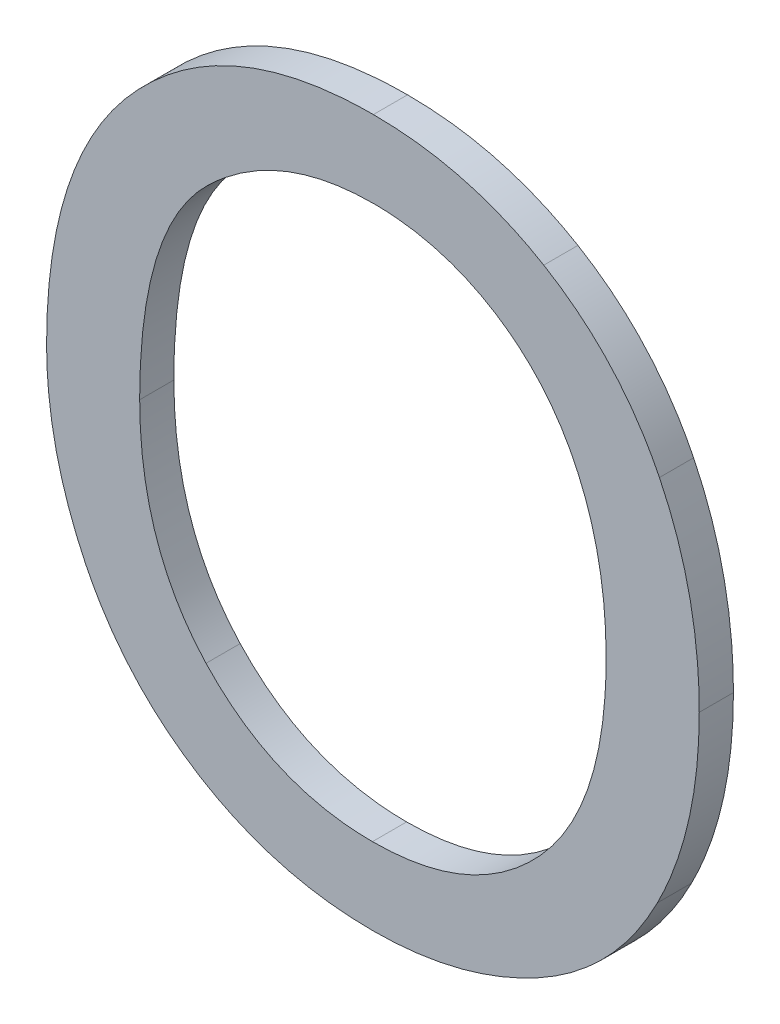
ISO-10303-21;
HEADER;
FILE_DESCRIPTION(('STEP AP214'),'2;1');
FILE_NAME('part.step','',(''),(''),'','','');
FILE_SCHEMA(('AUTOMOTIVE_DESIGN { 1 0 10303 214 1 1 1 1 }'));
ENDSEC;
DATA;
#1=APPLICATION_CONTEXT('core data for automotive mechanical design processes');
#2=APPLICATION_PROTOCOL_DEFINITION('international standard','automotive_design',2000,#1);
#3=PRODUCT_CONTEXT('',#1,'mechanical');
#4=PRODUCT('Part','Part','',(#3));
#5=PRODUCT_RELATED_PRODUCT_CATEGORY('part','',(#4));
#6=PRODUCT_DEFINITION_FORMATION('','',#4);
#7=PRODUCT_DEFINITION_CONTEXT('part definition',#1,'design');
#8=PRODUCT_DEFINITION('design','',#6,#7);
#9=PRODUCT_DEFINITION_SHAPE('','',#8);
#10=(LENGTH_UNIT() NAMED_UNIT(*) SI_UNIT(.MILLI.,.METRE.));
#11=(NAMED_UNIT(*) PLANE_ANGLE_UNIT() SI_UNIT($,.RADIAN.));
#12=(NAMED_UNIT(*) SI_UNIT($,.STERADIAN.) SOLID_ANGLE_UNIT());
#13=UNCERTAINTY_MEASURE_WITH_UNIT(LENGTH_MEASURE(1.E-05),#10,'distance_accuracy_value','');
#14=(GEOMETRIC_REPRESENTATION_CONTEXT(3) GLOBAL_UNCERTAINTY_ASSIGNED_CONTEXT((#13)) GLOBAL_UNIT_ASSIGNED_CONTEXT((#10,
#11,#12)) REPRESENTATION_CONTEXT('',''));
#15=CARTESIAN_POINT('',(0.,0.,0.));
#16=DIRECTION('',(0.,0.,1.));
#17=DIRECTION('',(1.,0.,0.));
#18=AXIS2_PLACEMENT_3D('',#15,#16,#17);
#19=CARTESIAN_POINT('',(7.100964176169,0.499921920118,0.05));
#20=DIRECTION('',(0.,0.,1.));
#21=DIRECTION('',(1.,0.,0.));
#22=AXIS2_PLACEMENT_3D('',#19,#20,#21);
#23=PLANE('',#22);
#24=CARTESIAN_POINT('',(6.759038880814,0.484965479651,0.05));
#25=CARTESIAN_POINT('',(6.759038880814,0.303733648256,0.05));
#26=CARTESIAN_POINT('',(6.856104651163,0.199445857558,0.05));
#27=(BOUNDED_CURVE() B_SPLINE_CURVE(2,(#24,#25,#26),.UNSPECIFIED.,.F.,
.F.) B_SPLINE_CURVE_WITH_KNOTS((3,3),(0.,1.),
.UNSPECIFIED.) CURVE() GEOMETRIC_REPRESENTATION_ITEM() RATIONAL_B_SPLINE_CURVE((1.,1.,1.)) REPRESENTATION_ITEM(''));
#28=CARTESIAN_POINT('',(6.759038880814,0.484965479651,0.05));
#29=VERTEX_POINT('',#28);
#30=CARTESIAN_POINT('',(6.856104651163,0.199445857558,0.05));
#31=VERTEX_POINT('',#30);
#32=EDGE_CURVE('E260',#29,#31,#27,.T.);
#33=ORIENTED_EDGE('',*,*,#32,.F.);
#34=CARTESIAN_POINT('',(6.860192587209,0.80804869186,0.05));
#35=CARTESIAN_POINT('',(6.759038880814,0.711300872093,0.05));
#36=CARTESIAN_POINT('',(6.759038880814,0.484965479651,0.05));
#37=(BOUNDED_CURVE() B_SPLINE_CURVE(2,(#34,#35,#36),.UNSPECIFIED.,.F.,
.F.) B_SPLINE_CURVE_WITH_KNOTS((3,3),(0.,1.),
.UNSPECIFIED.) CURVE() GEOMETRIC_REPRESENTATION_ITEM() RATIONAL_B_SPLINE_CURVE((1.,1.,1.)) REPRESENTATION_ITEM(''));
#38=CARTESIAN_POINT('',(6.860192587209,0.80804869186,0.05));
#39=VERTEX_POINT('',#38);
#40=EDGE_CURVE('E243',#39,#29,#37,.T.);
#41=ORIENTED_EDGE('',*,*,#40,.F.);
#42=CARTESIAN_POINT('',(7.101744186047,0.904796511628,0.05));
#43=CARTESIAN_POINT('',(6.961391715116,0.904796511628,0.05));
#44=CARTESIAN_POINT('',(6.860192587209,0.80804869186,0.05));
#45=(BOUNDED_CURVE() B_SPLINE_CURVE(2,(#42,#43,#44),.UNSPECIFIED.,.F.,
.F.) B_SPLINE_CURVE_WITH_KNOTS((3,3),(0.,1.),
.UNSPECIFIED.) CURVE() GEOMETRIC_REPRESENTATION_ITEM() RATIONAL_B_SPLINE_CURVE((1.,1.,1.)) REPRESENTATION_ITEM(''));
#46=CARTESIAN_POINT('',(7.101744186047,0.904796511628,0.05));
#47=VERTEX_POINT('',#46);
#48=EDGE_CURVE('E305',#47,#39,#45,.T.);
#49=ORIENTED_EDGE('',*,*,#48,.F.);
#50=CARTESIAN_POINT('',(7.279887354651,0.854514898256,0.05));
#51=CARTESIAN_POINT('',(7.200535973837,0.904796511628,0.05));
#52=CARTESIAN_POINT('',(7.101744186047,0.904796511628,0.05));
#53=(BOUNDED_CURVE() B_SPLINE_CURVE(2,(#50,#51,#52),.UNSPECIFIED.,.F.,
.F.) B_SPLINE_CURVE_WITH_KNOTS((3,3),(0.,1.),
.UNSPECIFIED.) CURVE() GEOMETRIC_REPRESENTATION_ITEM() RATIONAL_B_SPLINE_CURVE((1.,1.,1.)) REPRESENTATION_ITEM(''));
#54=CARTESIAN_POINT('',(7.279887354651,0.854514898256,0.05));
#55=VERTEX_POINT('',#54);
#56=EDGE_CURVE('E258',#55,#47,#53,.T.);
#57=ORIENTED_EDGE('',*,*,#56,.F.);
#58=CARTESIAN_POINT('',(7.400481468023,0.712981468023,0.05));
#59=CARTESIAN_POINT('',(7.359284156977,0.804278706395,0.05));
#60=CARTESIAN_POINT('',(7.279887354651,0.854514898256,0.05));
#61=(BOUNDED_CURVE() B_SPLINE_CURVE(2,(#58,#59,#60),.UNSPECIFIED.,.F.,
.F.) B_SPLINE_CURVE_WITH_KNOTS((3,3),(0.,1.),
.UNSPECIFIED.) CURVE() GEOMETRIC_REPRESENTATION_ITEM() RATIONAL_B_SPLINE_CURVE((1.,1.,1.)) REPRESENTATION_ITEM(''));
#62=CARTESIAN_POINT('',(7.400481468023,0.712981468023,0.05));
#63=VERTEX_POINT('',#62);
#64=EDGE_CURVE('E320',#63,#55,#61,.T.);
#65=ORIENTED_EDGE('',*,*,#64,.F.);
#66=CARTESIAN_POINT('',(7.441724200581,0.499318677326,0.05));
#67=CARTESIAN_POINT('',(7.441724200581,0.621729651163,0.05));
#68=CARTESIAN_POINT('',(7.400481468023,0.712981468023,0.05));
#69=(BOUNDED_CURVE() B_SPLINE_CURVE(2,(#66,#67,#68),.UNSPECIFIED.,.F.,
.F.) B_SPLINE_CURVE_WITH_KNOTS((3,3),(0.,1.),
.UNSPECIFIED.) CURVE() GEOMETRIC_REPRESENTATION_ITEM() RATIONAL_B_SPLINE_CURVE((1.,1.,1.)) REPRESENTATION_ITEM(''));
#70=CARTESIAN_POINT('',(7.441724200581,0.499318677326,0.05));
#71=VERTEX_POINT('',#70);
#72=EDGE_CURVE('E547',#71,#63,#69,.T.);
#73=ORIENTED_EDGE('',*,*,#72,.F.);
#74=CARTESIAN_POINT('',(7.345294331395,0.200490552326,0.05));
#75=CARTESIAN_POINT('',(7.441724200581,0.305823037791,0.05));
#76=CARTESIAN_POINT('',(7.441724200581,0.499318677326,0.05));
#77=(BOUNDED_CURVE() B_SPLINE_CURVE(2,(#74,#75,#76),.UNSPECIFIED.,.F.,
.F.) B_SPLINE_CURVE_WITH_KNOTS((3,3),(0.,1.),
.UNSPECIFIED.) CURVE() GEOMETRIC_REPRESENTATION_ITEM() RATIONAL_B_SPLINE_CURVE((1.,1.,1.)) REPRESENTATION_ITEM(''));
#78=CARTESIAN_POINT('',(7.345294331395,0.200490552326,0.05));
#79=VERTEX_POINT('',#78);
#80=EDGE_CURVE('E330',#79,#71,#77,.T.);
#81=ORIENTED_EDGE('',*,*,#80,.F.);
#82=CARTESIAN_POINT('',(7.099700218023,0.09520348837209,0.05));
#83=CARTESIAN_POINT('',(7.248909883721,0.09520348837209,0.05));
#84=CARTESIAN_POINT('',(7.345294331395,0.200490552326,0.05));
#85=(BOUNDED_CURVE() B_SPLINE_CURVE(2,(#82,#83,#84),.UNSPECIFIED.,.F.,
.F.) B_SPLINE_CURVE_WITH_KNOTS((3,3),(0.,1.),
.UNSPECIFIED.) CURVE() GEOMETRIC_REPRESENTATION_ITEM() RATIONAL_B_SPLINE_CURVE((1.,1.,1.)) REPRESENTATION_ITEM(''));
#86=CARTESIAN_POINT('',(7.099700218023,0.09520348837209,0.05));
#87=VERTEX_POINT('',#86);
#88=EDGE_CURVE('E281',#87,#79,#85,.T.);
#89=ORIENTED_EDGE('',*,*,#88,.F.);
#90=CARTESIAN_POINT('',(6.856104651163,0.199445857558,0.05));
#91=CARTESIAN_POINT('',(6.953215843023,0.09520348837209,0.05));
#92=CARTESIAN_POINT('',(7.099700218023,0.09520348837209,0.05));
#93=(BOUNDED_CURVE() B_SPLINE_CURVE(2,(#90,#91,#92),.UNSPECIFIED.,.F.,
.F.) B_SPLINE_CURVE_WITH_KNOTS((3,3),(0.,1.),
.UNSPECIFIED.) CURVE() GEOMETRIC_REPRESENTATION_ITEM() RATIONAL_B_SPLINE_CURVE((1.,1.,1.)) REPRESENTATION_ITEM(''));
#94=EDGE_CURVE('E29',#31,#87,#93,.T.);
#95=ORIENTED_EDGE('',*,*,#94,.F.);
#96=EDGE_LOOP('',(#33,#41,#49,#57,#65,#73,#81,#89,#95));
#97=FACE_BOUND('',#96,.T.);
#98=CARTESIAN_POINT('',(6.62277434593,0.486691497093,0.05));
#99=CARTESIAN_POINT('',(6.62277434593,0.735692223837,0.05));
#100=CARTESIAN_POINT('',(6.756313590116,0.876544331395,0.05));
#101=(BOUNDED_CURVE() B_SPLINE_CURVE(2,(#98,#99,#100),.UNSPECIFIED.,.F.,
.F.) B_SPLINE_CURVE_WITH_KNOTS((3,3),(0.,1.),
.UNSPECIFIED.) CURVE() GEOMETRIC_REPRESENTATION_ITEM() RATIONAL_B_SPLINE_CURVE((1.,1.,1.)) REPRESENTATION_ITEM(''));
#102=CARTESIAN_POINT('',(6.62277434593,0.486691497093,0.05));
#103=VERTEX_POINT('',#102);
#104=CARTESIAN_POINT('',(6.756313590116,0.876544331395,0.05));
#105=VERTEX_POINT('',#104);
#106=EDGE_CURVE('E293',#103,#105,#101,.T.);
#107=ORIENTED_EDGE('',*,*,#106,.F.);
#108=CARTESIAN_POINT('',(6.680005450581,0.237009447674,0.05));
#109=CARTESIAN_POINT('',(6.62277434593,0.355014534884,0.05));
#110=CARTESIAN_POINT('',(6.62277434593,0.486691497093,0.05));
#111=(BOUNDED_CURVE() B_SPLINE_CURVE(2,(#108,#109,#110),.UNSPECIFIED.,.F.,
.F.) B_SPLINE_CURVE_WITH_KNOTS((3,3),(0.,1.),
.UNSPECIFIED.) CURVE() GEOMETRIC_REPRESENTATION_ITEM() RATIONAL_B_SPLINE_CURVE((1.,1.,1.)) REPRESENTATION_ITEM(''));
#112=CARTESIAN_POINT('',(6.680005450581,0.237009447674,0.05));
#113=VERTEX_POINT('',#112);
#114=EDGE_CURVE('E275',#113,#103,#111,.T.);
#115=ORIENTED_EDGE('',*,*,#114,.F.);
#116=CARTESIAN_POINT('',(6.848292151163,0.05078125,0.05));
#117=CARTESIAN_POINT('',(6.737236555233,0.119004360465,0.05));
#118=CARTESIAN_POINT('',(6.680005450581,0.237009447674,0.05));
#119=(BOUNDED_CURVE() B_SPLINE_CURVE(2,(#116,#117,#118),.UNSPECIFIED.,.F.,
.F.) B_SPLINE_CURVE_WITH_KNOTS((3,3),(0.,1.),
.UNSPECIFIED.) CURVE() GEOMETRIC_REPRESENTATION_ITEM() RATIONAL_B_SPLINE_CURVE((1.,1.,1.)) REPRESENTATION_ITEM(''));
#120=CARTESIAN_POINT('',(6.848292151163,0.05078125,0.05));
#121=VERTEX_POINT('',#120);
#122=EDGE_CURVE('E310',#121,#113,#119,.T.);
#123=ORIENTED_EDGE('',*,*,#122,.F.);
#124=CARTESIAN_POINT('',(7.100381540698,-0.01744186046512,0.05));
#125=CARTESIAN_POINT('',(6.959347747093,-0.01744186046512,0.05));
#126=CARTESIAN_POINT('',(6.848292151163,0.05078125,0.05));
#127=(BOUNDED_CURVE() B_SPLINE_CURVE(2,(#124,#125,#126),.UNSPECIFIED.,.F.,
.F.) B_SPLINE_CURVE_WITH_KNOTS((3,3),(0.,1.),
.UNSPECIFIED.) CURVE() GEOMETRIC_REPRESENTATION_ITEM() RATIONAL_B_SPLINE_CURVE((1.,1.,1.)) REPRESENTATION_ITEM(''));
#128=CARTESIAN_POINT('',(7.100381540698,-0.01744186046512,0.05));
#129=VERTEX_POINT('',#128);
#130=EDGE_CURVE('E467',#129,#121,#127,.T.);
#131=ORIENTED_EDGE('',*,*,#130,.F.);
#132=CARTESIAN_POINT('',(7.342932412791,0.04428597383721,0.05));
#133=CARTESIAN_POINT('',(7.230514171512,-0.01744186046512,0.05));
#134=CARTESIAN_POINT('',(7.100381540698,-0.01744186046512,0.05));
#135=(BOUNDED_CURVE() B_SPLINE_CURVE(2,(#132,#133,#134),.UNSPECIFIED.,.F.,
.F.) B_SPLINE_CURVE_WITH_KNOTS((3,3),(0.,1.),
.UNSPECIFIED.) CURVE() GEOMETRIC_REPRESENTATION_ITEM() RATIONAL_B_SPLINE_CURVE((1.,1.,1.)) REPRESENTATION_ITEM(''));
#136=CARTESIAN_POINT('',(7.342932412791,0.04428597383721,0.05));
#137=VERTEX_POINT('',#136);
#138=EDGE_CURVE('E409',#137,#129,#135,.T.);
#139=ORIENTED_EDGE('',*,*,#138,.F.);
#140=CARTESIAN_POINT('',(7.516669694767,0.226062863372,0.05));
#141=CARTESIAN_POINT('',(7.45535065407,0.10601380814,0.05));
#142=CARTESIAN_POINT('',(7.342932412791,0.04428597383721,0.05));
#143=(BOUNDED_CURVE() B_SPLINE_CURVE(2,(#140,#141,#142),.UNSPECIFIED.,.F.,
.F.) B_SPLINE_CURVE_WITH_KNOTS((3,3),(0.,1.),
.UNSPECIFIED.) CURVE() GEOMETRIC_REPRESENTATION_ITEM() RATIONAL_B_SPLINE_CURVE((1.,1.,1.)) REPRESENTATION_ITEM(''));
#144=CARTESIAN_POINT('',(7.516669694767,0.226062863372,0.05));
#145=VERTEX_POINT('',#144);
#146=EDGE_CURVE('E232',#145,#137,#143,.T.);
#147=ORIENTED_EDGE('',*,*,#146,.F.);
#148=CARTESIAN_POINT('',(7.577988735465,0.498273982558,0.05));
#149=CARTESIAN_POINT('',(7.577988735465,0.346157340116,0.05));
#150=CARTESIAN_POINT('',(7.516669694767,0.226062863372,0.05));
#151=(BOUNDED_CURVE() B_SPLINE_CURVE(2,(#148,#149,#150),.UNSPECIFIED.,.F.,
.F.) B_SPLINE_CURVE_WITH_KNOTS((3,3),(0.,1.),
.UNSPECIFIED.) CURVE() GEOMETRIC_REPRESENTATION_ITEM() RATIONAL_B_SPLINE_CURVE((1.,1.,1.)) REPRESENTATION_ITEM(''));
#152=CARTESIAN_POINT('',(7.577988735465,0.498273982558,0.05));
#153=VERTEX_POINT('',#152);
#154=EDGE_CURVE('E219',#153,#145,#151,.T.);
#155=ORIENTED_EDGE('',*,*,#154,.F.);
#156=CARTESIAN_POINT('',(7.519712936047,0.766715116279,0.05));
#157=CARTESIAN_POINT('',(7.577988735465,0.648392078488,0.05));
#158=CARTESIAN_POINT('',(7.577988735465,0.498273982558,0.05));
#159=(BOUNDED_CURVE() B_SPLINE_CURVE(2,(#156,#157,#158),.UNSPECIFIED.,.F.,
.F.) B_SPLINE_CURVE_WITH_KNOTS((3,3),(0.,1.),
.UNSPECIFIED.) CURVE() GEOMETRIC_REPRESENTATION_ITEM() RATIONAL_B_SPLINE_CURVE((1.,1.,1.)) REPRESENTATION_ITEM(''));
#160=CARTESIAN_POINT('',(7.519712936047,0.766715116279,0.05));
#161=VERTEX_POINT('',#160);
#162=EDGE_CURVE('E208',#161,#153,#159,.T.);
#163=ORIENTED_EDGE('',*,*,#162,.F.);
#164=CARTESIAN_POINT('',(7.350426962209,0.951262718023,0.05));
#165=CARTESIAN_POINT('',(7.46148255814,0.885083575581,0.05));
#166=CARTESIAN_POINT('',(7.519712936047,0.766715116279,0.05));
#167=(BOUNDED_CURVE() B_SPLINE_CURVE(2,(#164,#165,#166),.UNSPECIFIED.,.F.,
.F.) B_SPLINE_CURVE_WITH_KNOTS((3,3),(0.,1.),
.UNSPECIFIED.) CURVE() GEOMETRIC_REPRESENTATION_ITEM() RATIONAL_B_SPLINE_CURVE((1.,1.,1.)) REPRESENTATION_ITEM(''));
#168=CARTESIAN_POINT('',(7.350426962209,0.951262718023,0.05));
#169=VERTEX_POINT('',#168);
#170=EDGE_CURVE('E304',#169,#161,#167,.T.);
#171=ORIENTED_EDGE('',*,*,#170,.F.);
#172=CARTESIAN_POINT('',(7.101062863372,1.017441860465,0.05));
#173=CARTESIAN_POINT('',(7.239371366279,1.017441860465,0.05));
#174=CARTESIAN_POINT('',(7.350426962209,0.951262718023,0.05));
#175=(BOUNDED_CURVE() B_SPLINE_CURVE(2,(#172,#173,#174),.UNSPECIFIED.,.F.,
.F.) B_SPLINE_CURVE_WITH_KNOTS((3,3),(0.,1.),
.UNSPECIFIED.) CURVE() GEOMETRIC_REPRESENTATION_ITEM() RATIONAL_B_SPLINE_CURVE((1.,1.,1.)) REPRESENTATION_ITEM(''));
#176=CARTESIAN_POINT('',(7.101062863372,1.017441860465,0.05));
#177=VERTEX_POINT('',#176);
#178=EDGE_CURVE('E433',#177,#169,#175,.T.);
#179=ORIENTED_EDGE('',*,*,#178,.F.);
#180=CARTESIAN_POINT('',(6.756313590116,0.876544331395,0.05));
#181=CARTESIAN_POINT('',(6.889852834302,1.017441860465,0.05));
#182=CARTESIAN_POINT('',(7.101062863372,1.017441860465,0.05));
#183=(BOUNDED_CURVE() B_SPLINE_CURVE(2,(#180,#181,#182),.UNSPECIFIED.,.F.,
.F.) B_SPLINE_CURVE_WITH_KNOTS((3,3),(0.,1.),
.UNSPECIFIED.) CURVE() GEOMETRIC_REPRESENTATION_ITEM() RATIONAL_B_SPLINE_CURVE((1.,1.,1.)) REPRESENTATION_ITEM(''));
#184=EDGE_CURVE('E432',#105,#177,#183,.T.);
#185=ORIENTED_EDGE('',*,*,#184,.F.);
#186=EDGE_LOOP('',(#107,#115,#123,#131,#139,#147,#155,#163,#171,#179,#185));
#187=FACE_BOUND('',#186,.T.);
#188=ADVANCED_FACE('F17',(#97,#187),#23,.T.);
#189=CARTESIAN_POINT('',(7.100964176169,0.499921920118,0.));
#190=DIRECTION('',(0.,0.,1.));
#191=DIRECTION('',(1.,0.,0.));
#192=AXIS2_PLACEMENT_3D('',#189,#190,#191);
#193=PLANE('',#192);
#194=CARTESIAN_POINT('',(6.856104651163,0.199445857558,0.));
#195=CARTESIAN_POINT('',(6.953215843023,0.09520348837209,0.));
#196=CARTESIAN_POINT('',(7.099700218023,0.09520348837209,0.));
#197=(BOUNDED_CURVE() B_SPLINE_CURVE(2,(#194,#195,#196),.UNSPECIFIED.,.F.,
.F.) B_SPLINE_CURVE_WITH_KNOTS((3,3),(0.,1.),
.UNSPECIFIED.) CURVE() GEOMETRIC_REPRESENTATION_ITEM() RATIONAL_B_SPLINE_CURVE((1.,1.,1.)) REPRESENTATION_ITEM(''));
#198=CARTESIAN_POINT('',(6.856104651163,0.199445857558,0.));
#199=VERTEX_POINT('',#198);
#200=CARTESIAN_POINT('',(7.099700218023,0.09520348837209,0.));
#201=VERTEX_POINT('',#200);
#202=EDGE_CURVE('E11',#199,#201,#197,.T.);
#203=ORIENTED_EDGE('',*,*,#202,.T.);
#204=CARTESIAN_POINT('',(7.099700218023,0.09520348837209,0.));
#205=CARTESIAN_POINT('',(7.248909883721,0.09520348837209,0.));
#206=CARTESIAN_POINT('',(7.345294331395,0.200490552326,0.));
#207=(BOUNDED_CURVE() B_SPLINE_CURVE(2,(#204,#205,#206),.UNSPECIFIED.,.F.,
.F.) B_SPLINE_CURVE_WITH_KNOTS((3,3),(0.,1.),
.UNSPECIFIED.) CURVE() GEOMETRIC_REPRESENTATION_ITEM() RATIONAL_B_SPLINE_CURVE((1.,1.,1.)) REPRESENTATION_ITEM(''));
#208=CARTESIAN_POINT('',(7.345294331395,0.200490552326,0.));
#209=VERTEX_POINT('',#208);
#210=EDGE_CURVE('E276',#201,#209,#207,.T.);
#211=ORIENTED_EDGE('',*,*,#210,.T.);
#212=CARTESIAN_POINT('',(7.345294331395,0.200490552326,0.));
#213=CARTESIAN_POINT('',(7.441724200581,0.305823037791,0.));
#214=CARTESIAN_POINT('',(7.441724200581,0.499318677326,0.));
#215=(BOUNDED_CURVE() B_SPLINE_CURVE(2,(#212,#213,#214),.UNSPECIFIED.,.F.,
.F.) B_SPLINE_CURVE_WITH_KNOTS((3,3),(0.,1.),
.UNSPECIFIED.) CURVE() GEOMETRIC_REPRESENTATION_ITEM() RATIONAL_B_SPLINE_CURVE((1.,1.,1.)) REPRESENTATION_ITEM(''));
#216=CARTESIAN_POINT('',(7.441724200581,0.499318677326,0.));
#217=VERTEX_POINT('',#216);
#218=EDGE_CURVE('E338',#209,#217,#215,.T.);
#219=ORIENTED_EDGE('',*,*,#218,.T.);
#220=CARTESIAN_POINT('',(7.441724200581,0.499318677326,0.));
#221=CARTESIAN_POINT('',(7.441724200581,0.621729651163,0.));
#222=CARTESIAN_POINT('',(7.400481468023,0.712981468023,0.));
#223=(BOUNDED_CURVE() B_SPLINE_CURVE(2,(#220,#221,#222),.UNSPECIFIED.,.F.,
.F.) B_SPLINE_CURVE_WITH_KNOTS((3,3),(0.,1.),
.UNSPECIFIED.) CURVE() GEOMETRIC_REPRESENTATION_ITEM() RATIONAL_B_SPLINE_CURVE((1.,1.,1.)) REPRESENTATION_ITEM(''));
#224=CARTESIAN_POINT('',(7.400481468023,0.712981468023,0.));
#225=VERTEX_POINT('',#224);
#226=EDGE_CURVE('E405',#217,#225,#223,.T.);
#227=ORIENTED_EDGE('',*,*,#226,.T.);
#228=CARTESIAN_POINT('',(7.400481468023,0.712981468023,0.));
#229=CARTESIAN_POINT('',(7.359284156977,0.804278706395,0.));
#230=CARTESIAN_POINT('',(7.279887354651,0.854514898256,0.));
#231=(BOUNDED_CURVE() B_SPLINE_CURVE(2,(#228,#229,#230),.UNSPECIFIED.,.F.,
.F.) B_SPLINE_CURVE_WITH_KNOTS((3,3),(0.,1.),
.UNSPECIFIED.) CURVE() GEOMETRIC_REPRESENTATION_ITEM() RATIONAL_B_SPLINE_CURVE((1.,1.,1.)) REPRESENTATION_ITEM(''));
#232=CARTESIAN_POINT('',(7.279887354651,0.854514898256,0.));
#233=VERTEX_POINT('',#232);
#234=EDGE_CURVE('E328',#225,#233,#231,.T.);
#235=ORIENTED_EDGE('',*,*,#234,.T.);
#236=CARTESIAN_POINT('',(7.279887354651,0.854514898256,0.));
#237=CARTESIAN_POINT('',(7.200535973837,0.904796511628,0.));
#238=CARTESIAN_POINT('',(7.101744186047,0.904796511628,0.));
#239=(BOUNDED_CURVE() B_SPLINE_CURVE(2,(#236,#237,#238),.UNSPECIFIED.,.F.,
.F.) B_SPLINE_CURVE_WITH_KNOTS((3,3),(0.,1.),
.UNSPECIFIED.) CURVE() GEOMETRIC_REPRESENTATION_ITEM() RATIONAL_B_SPLINE_CURVE((1.,1.,1.)) REPRESENTATION_ITEM(''));
#240=CARTESIAN_POINT('',(7.101744186047,0.904796511628,0.));
#241=VERTEX_POINT('',#240);
#242=EDGE_CURVE('E353',#233,#241,#239,.T.);
#243=ORIENTED_EDGE('',*,*,#242,.T.);
#244=CARTESIAN_POINT('',(7.101744186047,0.904796511628,0.));
#245=CARTESIAN_POINT('',(6.961391715116,0.904796511628,0.));
#246=CARTESIAN_POINT('',(6.860192587209,0.80804869186,0.));
#247=(BOUNDED_CURVE() B_SPLINE_CURVE(2,(#244,#245,#246),.UNSPECIFIED.,.F.,
.F.) B_SPLINE_CURVE_WITH_KNOTS((3,3),(0.,1.),
.UNSPECIFIED.) CURVE() GEOMETRIC_REPRESENTATION_ITEM() RATIONAL_B_SPLINE_CURVE((1.,1.,1.)) REPRESENTATION_ITEM(''));
#248=CARTESIAN_POINT('',(6.860192587209,0.80804869186,0.));
#249=VERTEX_POINT('',#248);
#250=EDGE_CURVE('E259',#241,#249,#247,.T.);
#251=ORIENTED_EDGE('',*,*,#250,.T.);
#252=CARTESIAN_POINT('',(6.860192587209,0.80804869186,0.));
#253=CARTESIAN_POINT('',(6.759038880814,0.711300872093,0.));
#254=CARTESIAN_POINT('',(6.759038880814,0.484965479651,0.));
#255=(BOUNDED_CURVE() B_SPLINE_CURVE(2,(#252,#253,#254),.UNSPECIFIED.,.F.,
.F.) B_SPLINE_CURVE_WITH_KNOTS((3,3),(0.,1.),
.UNSPECIFIED.) CURVE() GEOMETRIC_REPRESENTATION_ITEM() RATIONAL_B_SPLINE_CURVE((1.,1.,1.)) REPRESENTATION_ITEM(''));
#256=CARTESIAN_POINT('',(6.759038880814,0.484965479651,0.));
#257=VERTEX_POINT('',#256);
#258=EDGE_CURVE('E245',#249,#257,#255,.T.);
#259=ORIENTED_EDGE('',*,*,#258,.T.);
#260=CARTESIAN_POINT('',(6.759038880814,0.484965479651,0.));
#261=CARTESIAN_POINT('',(6.759038880814,0.303733648256,0.));
#262=CARTESIAN_POINT('',(6.856104651163,0.199445857558,0.));
#263=(BOUNDED_CURVE() B_SPLINE_CURVE(2,(#260,#261,#262),.UNSPECIFIED.,.F.,
.F.) B_SPLINE_CURVE_WITH_KNOTS((3,3),(0.,1.),
.UNSPECIFIED.) CURVE() GEOMETRIC_REPRESENTATION_ITEM() RATIONAL_B_SPLINE_CURVE((1.,1.,1.)) REPRESENTATION_ITEM(''));
#264=EDGE_CURVE('E244',#257,#199,#263,.T.);
#265=ORIENTED_EDGE('',*,*,#264,.T.);
#266=EDGE_LOOP('',(#203,#211,#219,#227,#235,#243,#251,#259,#265));
#267=FACE_BOUND('',#266,.T.);
#268=CARTESIAN_POINT('',(6.756313590116,0.876544331395,0.));
#269=CARTESIAN_POINT('',(6.889852834302,1.017441860465,0.));
#270=CARTESIAN_POINT('',(7.101062863372,1.017441860465,0.));
#271=(BOUNDED_CURVE() B_SPLINE_CURVE(2,(#268,#269,#270),.UNSPECIFIED.,.F.,
.F.) B_SPLINE_CURVE_WITH_KNOTS((3,3),(0.,1.),
.UNSPECIFIED.) CURVE() GEOMETRIC_REPRESENTATION_ITEM() RATIONAL_B_SPLINE_CURVE((1.,1.,1.)) REPRESENTATION_ITEM(''));
#272=CARTESIAN_POINT('',(6.756313590116,0.876544331395,0.));
#273=VERTEX_POINT('',#272);
#274=CARTESIAN_POINT('',(7.101062863372,1.017441860465,0.));
#275=VERTEX_POINT('',#274);
#276=EDGE_CURVE('E288',#273,#275,#271,.T.);
#277=ORIENTED_EDGE('',*,*,#276,.T.);
#278=CARTESIAN_POINT('',(7.101062863372,1.017441860465,0.));
#279=CARTESIAN_POINT('',(7.239371366279,1.017441860465,0.));
#280=CARTESIAN_POINT('',(7.350426962209,0.951262718023,0.));
#281=(BOUNDED_CURVE() B_SPLINE_CURVE(2,(#278,#279,#280),.UNSPECIFIED.,.F.,
.F.) B_SPLINE_CURVE_WITH_KNOTS((3,3),(0.,1.),
.UNSPECIFIED.) CURVE() GEOMETRIC_REPRESENTATION_ITEM() RATIONAL_B_SPLINE_CURVE((1.,1.,1.)) REPRESENTATION_ITEM(''));
#282=CARTESIAN_POINT('',(7.350426962209,0.951262718023,0.));
#283=VERTEX_POINT('',#282);
#284=EDGE_CURVE('E424',#275,#283,#281,.T.);
#285=ORIENTED_EDGE('',*,*,#284,.T.);
#286=CARTESIAN_POINT('',(7.350426962209,0.951262718023,0.));
#287=CARTESIAN_POINT('',(7.46148255814,0.885083575581,0.));
#288=CARTESIAN_POINT('',(7.519712936047,0.766715116279,0.));
#289=(BOUNDED_CURVE() B_SPLINE_CURVE(2,(#286,#287,#288),.UNSPECIFIED.,.F.,
.F.) B_SPLINE_CURVE_WITH_KNOTS((3,3),(0.,1.),
.UNSPECIFIED.) CURVE() GEOMETRIC_REPRESENTATION_ITEM() RATIONAL_B_SPLINE_CURVE((1.,1.,1.)) REPRESENTATION_ITEM(''));
#290=CARTESIAN_POINT('',(7.519712936047,0.766715116279,0.));
#291=VERTEX_POINT('',#290);
#292=EDGE_CURVE('E201',#283,#291,#289,.T.);
#293=ORIENTED_EDGE('',*,*,#292,.T.);
#294=CARTESIAN_POINT('',(7.519712936047,0.766715116279,0.));
#295=CARTESIAN_POINT('',(7.577988735465,0.648392078488,0.));
#296=CARTESIAN_POINT('',(7.577988735465,0.498273982558,0.));
#297=(BOUNDED_CURVE() B_SPLINE_CURVE(2,(#294,#295,#296),.UNSPECIFIED.,.F.,
.F.) B_SPLINE_CURVE_WITH_KNOTS((3,3),(0.,1.),
.UNSPECIFIED.) CURVE() GEOMETRIC_REPRESENTATION_ITEM() RATIONAL_B_SPLINE_CURVE((1.,1.,1.)) REPRESENTATION_ITEM(''));
#298=CARTESIAN_POINT('',(7.577988735465,0.498273982558,0.));
#299=VERTEX_POINT('',#298);
#300=EDGE_CURVE('E195',#291,#299,#297,.T.);
#301=ORIENTED_EDGE('',*,*,#300,.T.);
#302=CARTESIAN_POINT('',(7.577988735465,0.498273982558,0.));
#303=CARTESIAN_POINT('',(7.577988735465,0.346157340116,0.));
#304=CARTESIAN_POINT('',(7.516669694767,0.226062863372,0.));
#305=(BOUNDED_CURVE() B_SPLINE_CURVE(2,(#302,#303,#304),.UNSPECIFIED.,.F.,
.F.) B_SPLINE_CURVE_WITH_KNOTS((3,3),(0.,1.),
.UNSPECIFIED.) CURVE() GEOMETRIC_REPRESENTATION_ITEM() RATIONAL_B_SPLINE_CURVE((1.,1.,1.)) REPRESENTATION_ITEM(''));
#306=CARTESIAN_POINT('',(7.516669694767,0.226062863372,0.));
#307=VERTEX_POINT('',#306);
#308=EDGE_CURVE('E198',#299,#307,#305,.T.);
#309=ORIENTED_EDGE('',*,*,#308,.T.);
#310=CARTESIAN_POINT('',(7.516669694767,0.226062863372,0.));
#311=CARTESIAN_POINT('',(7.45535065407,0.10601380814,0.));
#312=CARTESIAN_POINT('',(7.342932412791,0.04428597383721,0.));
#313=(BOUNDED_CURVE() B_SPLINE_CURVE(2,(#310,#311,#312),.UNSPECIFIED.,.F.,
.F.) B_SPLINE_CURVE_WITH_KNOTS((3,3),(0.,1.),
.UNSPECIFIED.) CURVE() GEOMETRIC_REPRESENTATION_ITEM() RATIONAL_B_SPLINE_CURVE((1.,1.,1.)) REPRESENTATION_ITEM(''));
#314=CARTESIAN_POINT('',(7.342932412791,0.04428597383721,0.));
#315=VERTEX_POINT('',#314);
#316=EDGE_CURVE('E224',#307,#315,#313,.T.);
#317=ORIENTED_EDGE('',*,*,#316,.T.);
#318=CARTESIAN_POINT('',(7.342932412791,0.04428597383721,0.));
#319=CARTESIAN_POINT('',(7.230514171512,-0.01744186046512,0.));
#320=CARTESIAN_POINT('',(7.100381540698,-0.01744186046512,0.));
#321=(BOUNDED_CURVE() B_SPLINE_CURVE(2,(#318,#319,#320),.UNSPECIFIED.,.F.,
.F.) B_SPLINE_CURVE_WITH_KNOTS((3,3),(0.,1.),
.UNSPECIFIED.) CURVE() GEOMETRIC_REPRESENTATION_ITEM() RATIONAL_B_SPLINE_CURVE((1.,1.,1.)) REPRESENTATION_ITEM(''));
#322=CARTESIAN_POINT('',(7.100381540698,-0.01744186046512,0.));
#323=VERTEX_POINT('',#322);
#324=EDGE_CURVE('E413',#315,#323,#321,.T.);
#325=ORIENTED_EDGE('',*,*,#324,.T.);
#326=CARTESIAN_POINT('',(7.100381540698,-0.01744186046512,0.));
#327=CARTESIAN_POINT('',(6.959347747093,-0.01744186046512,0.));
#328=CARTESIAN_POINT('',(6.848292151163,0.05078125,0.));
#329=(BOUNDED_CURVE() B_SPLINE_CURVE(2,(#326,#327,#328),.UNSPECIFIED.,.F.,
.F.) B_SPLINE_CURVE_WITH_KNOTS((3,3),(0.,1.),
.UNSPECIFIED.) CURVE() GEOMETRIC_REPRESENTATION_ITEM() RATIONAL_B_SPLINE_CURVE((1.,1.,1.)) REPRESENTATION_ITEM(''));
#330=CARTESIAN_POINT('',(6.848292151163,0.05078125,0.));
#331=VERTEX_POINT('',#330);
#332=EDGE_CURVE('E459',#323,#331,#329,.T.);
#333=ORIENTED_EDGE('',*,*,#332,.T.);
#334=CARTESIAN_POINT('',(6.848292151163,0.05078125,0.));
#335=CARTESIAN_POINT('',(6.737236555233,0.119004360465,0.));
#336=CARTESIAN_POINT('',(6.680005450581,0.237009447674,0.));
#337=(BOUNDED_CURVE() B_SPLINE_CURVE(2,(#334,#335,#336),.UNSPECIFIED.,.F.,
.F.) B_SPLINE_CURVE_WITH_KNOTS((3,3),(0.,1.),
.UNSPECIFIED.) CURVE() GEOMETRIC_REPRESENTATION_ITEM() RATIONAL_B_SPLINE_CURVE((1.,1.,1.)) REPRESENTATION_ITEM(''));
#338=CARTESIAN_POINT('',(6.680005450581,0.237009447674,0.));
#339=VERTEX_POINT('',#338);
#340=EDGE_CURVE('E318',#331,#339,#337,.T.);
#341=ORIENTED_EDGE('',*,*,#340,.T.);
#342=CARTESIAN_POINT('',(6.680005450581,0.237009447674,0.));
#343=CARTESIAN_POINT('',(6.62277434593,0.355014534884,0.));
#344=CARTESIAN_POINT('',(6.62277434593,0.486691497093,0.));
#345=(BOUNDED_CURVE() B_SPLINE_CURVE(2,(#342,#343,#344),.UNSPECIFIED.,.F.,
.F.) B_SPLINE_CURVE_WITH_KNOTS((3,3),(0.,1.),
.UNSPECIFIED.) CURVE() GEOMETRIC_REPRESENTATION_ITEM() RATIONAL_B_SPLINE_CURVE((1.,1.,1.)) REPRESENTATION_ITEM(''));
#346=CARTESIAN_POINT('',(6.62277434593,0.486691497093,0.));
#347=VERTEX_POINT('',#346);
#348=EDGE_CURVE('E346',#339,#347,#345,.T.);
#349=ORIENTED_EDGE('',*,*,#348,.T.);
#350=CARTESIAN_POINT('',(6.62277434593,0.486691497093,0.));
#351=CARTESIAN_POINT('',(6.62277434593,0.735692223837,0.));
#352=CARTESIAN_POINT('',(6.756313590116,0.876544331395,0.));
#353=(BOUNDED_CURVE() B_SPLINE_CURVE(2,(#350,#351,#352),.UNSPECIFIED.,.F.,
.F.) B_SPLINE_CURVE_WITH_KNOTS((3,3),(0.,1.),
.UNSPECIFIED.) CURVE() GEOMETRIC_REPRESENTATION_ITEM() RATIONAL_B_SPLINE_CURVE((1.,1.,1.)) REPRESENTATION_ITEM(''));
#354=EDGE_CURVE('E236',#347,#273,#353,.T.);
#355=ORIENTED_EDGE('',*,*,#354,.T.);
#356=EDGE_LOOP('',(#277,#285,#293,#301,#309,#317,#325,#333,#341,#349,#355));
#357=FACE_BOUND('',#356,.T.);
#358=ADVANCED_FACE('F197',(#267,#357),#193,.F.);
#359=CARTESIAN_POINT('',(6.856104651163,0.199445857558,0.));
#360=CARTESIAN_POINT('',(6.953215843023,0.09520348837209,0.));
#361=CARTESIAN_POINT('',(7.099700218023,0.09520348837209,0.));
#362=(BOUNDED_CURVE() B_SPLINE_CURVE(2,(#359,#360,#361),.UNSPECIFIED.,.F.,
.F.) B_SPLINE_CURVE_WITH_KNOTS((3,3),(0.,1.),
.UNSPECIFIED.) CURVE() GEOMETRIC_REPRESENTATION_ITEM() RATIONAL_B_SPLINE_CURVE((1.,1.,1.)) REPRESENTATION_ITEM(''));
#363=DIRECTION('',(0.,0.,-1.));
#364=VECTOR('',#363,1.);
#365=SURFACE_OF_LINEAR_EXTRUSION('',#362,#364);
#366=DIRECTION('',(0.,0.,1.));
#367=VECTOR('',#366,1.);
#368=CARTESIAN_POINT('',(6.856104651163,0.199445857558,0.));
#369=LINE('',#368,#367);
#370=EDGE_CURVE('E266',#199,#31,#369,.T.);
#371=ORIENTED_EDGE('',*,*,#370,.T.);
#372=ORIENTED_EDGE('',*,*,#94,.T.);
#373=DIRECTION('',(0.,0.,1.));
#374=VECTOR('',#373,1.);
#375=CARTESIAN_POINT('',(7.099700218023,0.09520348837209,0.));
#376=LINE('',#375,#374);
#377=EDGE_CURVE('E380',#201,#87,#376,.T.);
#378=ORIENTED_EDGE('',*,*,#377,.F.);
#379=ORIENTED_EDGE('',*,*,#202,.F.);
#380=EDGE_LOOP('',(#371,#372,#378,#379));
#381=FACE_BOUND('',#380,.T.);
#382=ADVANCED_FACE('F19',(#381),#365,.T.);
#383=CARTESIAN_POINT('',(7.099700218023,0.09520348837209,0.));
#384=CARTESIAN_POINT('',(7.248909883721,0.09520348837209,0.));
#385=CARTESIAN_POINT('',(7.345294331395,0.200490552326,0.));
#386=(BOUNDED_CURVE() B_SPLINE_CURVE(2,(#383,#384,#385),.UNSPECIFIED.,.F.,
.F.) B_SPLINE_CURVE_WITH_KNOTS((3,3),(0.,1.),
.UNSPECIFIED.) CURVE() GEOMETRIC_REPRESENTATION_ITEM() RATIONAL_B_SPLINE_CURVE((1.,1.,1.)) REPRESENTATION_ITEM(''));
#387=DIRECTION('',(0.,0.,-1.));
#388=VECTOR('',#387,1.);
#389=SURFACE_OF_LINEAR_EXTRUSION('',#386,#388);
#390=ORIENTED_EDGE('',*,*,#377,.T.);
#391=ORIENTED_EDGE('',*,*,#88,.T.);
#392=DIRECTION('',(0.,0.,1.));
#393=VECTOR('',#392,1.);
#394=CARTESIAN_POINT('',(7.345294331395,0.200490552326,0.));
#395=LINE('',#394,#393);
#396=EDGE_CURVE('E22',#209,#79,#395,.T.);
#397=ORIENTED_EDGE('',*,*,#396,.F.);
#398=ORIENTED_EDGE('',*,*,#210,.F.);
#399=EDGE_LOOP('',(#390,#391,#397,#398));
#400=FACE_BOUND('',#399,.T.);
#401=ADVANCED_FACE('F747',(#400),#389,.T.);
#402=CARTESIAN_POINT('',(7.345294331395,0.200490552326,0.));
#403=CARTESIAN_POINT('',(7.441724200581,0.305823037791,0.));
#404=CARTESIAN_POINT('',(7.441724200581,0.499318677326,0.));
#405=(BOUNDED_CURVE() B_SPLINE_CURVE(2,(#402,#403,#404),.UNSPECIFIED.,.F.,
.F.) B_SPLINE_CURVE_WITH_KNOTS((3,3),(0.,1.),
.UNSPECIFIED.) CURVE() GEOMETRIC_REPRESENTATION_ITEM() RATIONAL_B_SPLINE_CURVE((1.,1.,1.)) REPRESENTATION_ITEM(''));
#406=DIRECTION('',(0.,0.,-1.));
#407=VECTOR('',#406,1.);
#408=SURFACE_OF_LINEAR_EXTRUSION('',#405,#407);
#409=ORIENTED_EDGE('',*,*,#396,.T.);
#410=ORIENTED_EDGE('',*,*,#80,.T.);
#411=DIRECTION('',(0.,0.,1.));
#412=VECTOR('',#411,1.);
#413=CARTESIAN_POINT('',(7.441724200581,0.499318677326,0.));
#414=LINE('',#413,#412);
#415=EDGE_CURVE('E372',#217,#71,#414,.T.);
#416=ORIENTED_EDGE('',*,*,#415,.F.);
#417=ORIENTED_EDGE('',*,*,#218,.F.);
#418=EDGE_LOOP('',(#409,#410,#416,#417));
#419=FACE_BOUND('',#418,.T.);
#420=ADVANCED_FACE('F744',(#419),#408,.T.);
#421=CARTESIAN_POINT('',(7.441724200581,0.499318677326,0.));
#422=CARTESIAN_POINT('',(7.441724200581,0.621729651163,0.));
#423=CARTESIAN_POINT('',(7.400481468023,0.712981468023,0.));
#424=(BOUNDED_CURVE() B_SPLINE_CURVE(2,(#421,#422,#423),.UNSPECIFIED.,.F.,
.F.) B_SPLINE_CURVE_WITH_KNOTS((3,3),(0.,1.),
.UNSPECIFIED.) CURVE() GEOMETRIC_REPRESENTATION_ITEM() RATIONAL_B_SPLINE_CURVE((1.,1.,1.)) REPRESENTATION_ITEM(''));
#425=DIRECTION('',(0.,0.,-1.));
#426=VECTOR('',#425,1.);
#427=SURFACE_OF_LINEAR_EXTRUSION('',#424,#426);
#428=ORIENTED_EDGE('',*,*,#415,.T.);
#429=ORIENTED_EDGE('',*,*,#72,.T.);
#430=DIRECTION('',(0.,0.,1.));
#431=VECTOR('',#430,1.);
#432=CARTESIAN_POINT('',(7.400481468023,0.712981468023,0.));
#433=LINE('',#432,#431);
#434=EDGE_CURVE('E329',#225,#63,#433,.T.);
#435=ORIENTED_EDGE('',*,*,#434,.F.);
#436=ORIENTED_EDGE('',*,*,#226,.F.);
#437=EDGE_LOOP('',(#428,#429,#435,#436));
#438=FACE_BOUND('',#437,.T.);
#439=ADVANCED_FACE('F746',(#438),#427,.T.);
#440=CARTESIAN_POINT('',(7.400481468023,0.712981468023,0.));
#441=CARTESIAN_POINT('',(7.359284156977,0.804278706395,0.));
#442=CARTESIAN_POINT('',(7.279887354651,0.854514898256,0.));
#443=(BOUNDED_CURVE() B_SPLINE_CURVE(2,(#440,#441,#442),.UNSPECIFIED.,.F.,
.F.) B_SPLINE_CURVE_WITH_KNOTS((3,3),(0.,1.),
.UNSPECIFIED.) CURVE() GEOMETRIC_REPRESENTATION_ITEM() RATIONAL_B_SPLINE_CURVE((1.,1.,1.)) REPRESENTATION_ITEM(''));
#444=DIRECTION('',(0.,0.,-1.));
#445=VECTOR('',#444,1.);
#446=SURFACE_OF_LINEAR_EXTRUSION('',#443,#445);
#447=ORIENTED_EDGE('',*,*,#434,.T.);
#448=ORIENTED_EDGE('',*,*,#64,.T.);
#449=DIRECTION('',(0.,0.,1.));
#450=VECTOR('',#449,1.);
#451=CARTESIAN_POINT('',(7.279887354651,0.854514898256,0.));
#452=LINE('',#451,#450);
#453=EDGE_CURVE('E251',#233,#55,#452,.T.);
#454=ORIENTED_EDGE('',*,*,#453,.F.);
#455=ORIENTED_EDGE('',*,*,#234,.F.);
#456=EDGE_LOOP('',(#447,#448,#454,#455));
#457=FACE_BOUND('',#456,.T.);
#458=ADVANCED_FACE('F677',(#457),#446,.T.);
#459=CARTESIAN_POINT('',(7.279887354651,0.854514898256,0.));
#460=CARTESIAN_POINT('',(7.200535973837,0.904796511628,0.));
#461=CARTESIAN_POINT('',(7.101744186047,0.904796511628,0.));
#462=(BOUNDED_CURVE() B_SPLINE_CURVE(2,(#459,#460,#461),.UNSPECIFIED.,.F.,
.F.) B_SPLINE_CURVE_WITH_KNOTS((3,3),(0.,1.),
.UNSPECIFIED.) CURVE() GEOMETRIC_REPRESENTATION_ITEM() RATIONAL_B_SPLINE_CURVE((1.,1.,1.)) REPRESENTATION_ITEM(''));
#463=DIRECTION('',(0.,0.,-1.));
#464=VECTOR('',#463,1.);
#465=SURFACE_OF_LINEAR_EXTRUSION('',#462,#464);
#466=ORIENTED_EDGE('',*,*,#453,.T.);
#467=ORIENTED_EDGE('',*,*,#56,.T.);
#468=DIRECTION('',(0.,0.,1.));
#469=VECTOR('',#468,1.);
#470=CARTESIAN_POINT('',(7.101744186047,0.904796511628,0.));
#471=LINE('',#470,#469);
#472=EDGE_CURVE('E250',#241,#47,#471,.T.);
#473=ORIENTED_EDGE('',*,*,#472,.F.);
#474=ORIENTED_EDGE('',*,*,#242,.F.);
#475=EDGE_LOOP('',(#466,#467,#473,#474));
#476=FACE_BOUND('',#475,.T.);
#477=ADVANCED_FACE('F674',(#476),#465,.T.);
#478=CARTESIAN_POINT('',(7.101744186047,0.904796511628,0.));
#479=CARTESIAN_POINT('',(6.961391715116,0.904796511628,0.));
#480=CARTESIAN_POINT('',(6.860192587209,0.80804869186,0.));
#481=(BOUNDED_CURVE() B_SPLINE_CURVE(2,(#478,#479,#480),.UNSPECIFIED.,.F.,
.F.) B_SPLINE_CURVE_WITH_KNOTS((3,3),(0.,1.),
.UNSPECIFIED.) CURVE() GEOMETRIC_REPRESENTATION_ITEM() RATIONAL_B_SPLINE_CURVE((1.,1.,1.)) REPRESENTATION_ITEM(''));
#482=DIRECTION('',(0.,0.,-1.));
#483=VECTOR('',#482,1.);
#484=SURFACE_OF_LINEAR_EXTRUSION('',#481,#483);
#485=ORIENTED_EDGE('',*,*,#472,.T.);
#486=ORIENTED_EDGE('',*,*,#48,.T.);
#487=DIRECTION('',(0.,0.,1.));
#488=VECTOR('',#487,1.);
#489=CARTESIAN_POINT('',(6.860192587209,0.80804869186,0.));
#490=LINE('',#489,#488);
#491=EDGE_CURVE('E240',#249,#39,#490,.T.);
#492=ORIENTED_EDGE('',*,*,#491,.F.);
#493=ORIENTED_EDGE('',*,*,#250,.F.);
#494=EDGE_LOOP('',(#485,#486,#492,#493));
#495=FACE_BOUND('',#494,.T.);
#496=ADVANCED_FACE('F671',(#495),#484,.T.);
#497=CARTESIAN_POINT('',(6.860192587209,0.80804869186,0.));
#498=CARTESIAN_POINT('',(6.759038880814,0.711300872093,0.));
#499=CARTESIAN_POINT('',(6.759038880814,0.484965479651,0.));
#500=(BOUNDED_CURVE() B_SPLINE_CURVE(2,(#497,#498,#499),.UNSPECIFIED.,.F.,
.F.) B_SPLINE_CURVE_WITH_KNOTS((3,3),(0.,1.),
.UNSPECIFIED.) CURVE() GEOMETRIC_REPRESENTATION_ITEM() RATIONAL_B_SPLINE_CURVE((1.,1.,1.)) REPRESENTATION_ITEM(''));
#501=DIRECTION('',(0.,0.,-1.));
#502=VECTOR('',#501,1.);
#503=SURFACE_OF_LINEAR_EXTRUSION('',#500,#502);
#504=ORIENTED_EDGE('',*,*,#491,.T.);
#505=ORIENTED_EDGE('',*,*,#40,.T.);
#506=DIRECTION('',(0.,0.,1.));
#507=VECTOR('',#506,1.);
#508=CARTESIAN_POINT('',(6.759038880814,0.484965479651,0.));
#509=LINE('',#508,#507);
#510=EDGE_CURVE('E267',#257,#29,#509,.T.);
#511=ORIENTED_EDGE('',*,*,#510,.F.);
#512=ORIENTED_EDGE('',*,*,#258,.F.);
#513=EDGE_LOOP('',(#504,#505,#511,#512));
#514=FACE_BOUND('',#513,.T.);
#515=ADVANCED_FACE('F785',(#514),#503,.T.);
#516=CARTESIAN_POINT('',(6.759038880814,0.484965479651,0.));
#517=CARTESIAN_POINT('',(6.759038880814,0.303733648256,0.));
#518=CARTESIAN_POINT('',(6.856104651163,0.199445857558,0.));
#519=(BOUNDED_CURVE() B_SPLINE_CURVE(2,(#516,#517,#518),.UNSPECIFIED.,.F.,
.F.) B_SPLINE_CURVE_WITH_KNOTS((3,3),(0.,1.),
.UNSPECIFIED.) CURVE() GEOMETRIC_REPRESENTATION_ITEM() RATIONAL_B_SPLINE_CURVE((1.,1.,1.)) REPRESENTATION_ITEM(''));
#520=DIRECTION('',(0.,0.,-1.));
#521=VECTOR('',#520,1.);
#522=SURFACE_OF_LINEAR_EXTRUSION('',#519,#521);
#523=ORIENTED_EDGE('',*,*,#510,.T.);
#524=ORIENTED_EDGE('',*,*,#32,.T.);
#525=ORIENTED_EDGE('',*,*,#370,.F.);
#526=ORIENTED_EDGE('',*,*,#264,.F.);
#527=EDGE_LOOP('',(#523,#524,#525,#526));
#528=FACE_BOUND('',#527,.T.);
#529=ADVANCED_FACE('F758',(#528),#522,.T.);
#530=CARTESIAN_POINT('',(6.756313590116,0.876544331395,0.));
#531=CARTESIAN_POINT('',(6.889852834302,1.017441860465,0.));
#532=CARTESIAN_POINT('',(7.101062863372,1.017441860465,0.));
#533=(BOUNDED_CURVE() B_SPLINE_CURVE(2,(#530,#531,#532),.UNSPECIFIED.,.F.,
.F.) B_SPLINE_CURVE_WITH_KNOTS((3,3),(0.,1.),
.UNSPECIFIED.) CURVE() GEOMETRIC_REPRESENTATION_ITEM() RATIONAL_B_SPLINE_CURVE((1.,1.,1.)) REPRESENTATION_ITEM(''));
#534=DIRECTION('',(0.,0.,-1.));
#535=VECTOR('',#534,1.);
#536=SURFACE_OF_LINEAR_EXTRUSION('',#533,#535);
#537=DIRECTION('',(0.,0.,1.));
#538=VECTOR('',#537,1.);
#539=CARTESIAN_POINT('',(6.756313590116,0.876544331395,0.));
#540=LINE('',#539,#538);
#541=EDGE_CURVE('E423',#273,#105,#540,.T.);
#542=ORIENTED_EDGE('',*,*,#541,.T.);
#543=ORIENTED_EDGE('',*,*,#184,.T.);
#544=DIRECTION('',(0.,0.,1.));
#545=VECTOR('',#544,1.);
#546=CARTESIAN_POINT('',(7.101062863372,1.017441860465,0.));
#547=LINE('',#546,#545);
#548=EDGE_CURVE('E491',#275,#177,#547,.T.);
#549=ORIENTED_EDGE('',*,*,#548,.F.);
#550=ORIENTED_EDGE('',*,*,#276,.F.);
#551=EDGE_LOOP('',(#542,#543,#549,#550));
#552=FACE_BOUND('',#551,.T.);
#553=ADVANCED_FACE('F635',(#552),#536,.T.);
#554=CARTESIAN_POINT('',(7.101062863372,1.017441860465,0.));
#555=CARTESIAN_POINT('',(7.239371366279,1.017441860465,0.));
#556=CARTESIAN_POINT('',(7.350426962209,0.951262718023,0.));
#557=(BOUNDED_CURVE() B_SPLINE_CURVE(2,(#554,#555,#556),.UNSPECIFIED.,.F.,
.F.) B_SPLINE_CURVE_WITH_KNOTS((3,3),(0.,1.),
.UNSPECIFIED.) CURVE() GEOMETRIC_REPRESENTATION_ITEM() RATIONAL_B_SPLINE_CURVE((1.,1.,1.)) REPRESENTATION_ITEM(''));
#558=DIRECTION('',(0.,0.,-1.));
#559=VECTOR('',#558,1.);
#560=SURFACE_OF_LINEAR_EXTRUSION('',#557,#559);
#561=ORIENTED_EDGE('',*,*,#548,.T.);
#562=ORIENTED_EDGE('',*,*,#178,.T.);
#563=DIRECTION('',(0.,0.,1.));
#564=VECTOR('',#563,1.);
#565=CARTESIAN_POINT('',(7.350426962209,0.951262718023,0.));
#566=LINE('',#565,#564);
#567=EDGE_CURVE('E207',#283,#169,#566,.T.);
#568=ORIENTED_EDGE('',*,*,#567,.F.);
#569=ORIENTED_EDGE('',*,*,#284,.F.);
#570=EDGE_LOOP('',(#561,#562,#568,#569));
#571=FACE_BOUND('',#570,.T.);
#572=ADVANCED_FACE('F637',(#571),#560,.T.);
#573=CARTESIAN_POINT('',(7.350426962209,0.951262718023,0.));
#574=CARTESIAN_POINT('',(7.46148255814,0.885083575581,0.));
#575=CARTESIAN_POINT('',(7.519712936047,0.766715116279,0.));
#576=(BOUNDED_CURVE() B_SPLINE_CURVE(2,(#573,#574,#575),.UNSPECIFIED.,.F.,
.F.) B_SPLINE_CURVE_WITH_KNOTS((3,3),(0.,1.),
.UNSPECIFIED.) CURVE() GEOMETRIC_REPRESENTATION_ITEM() RATIONAL_B_SPLINE_CURVE((1.,1.,1.)) REPRESENTATION_ITEM(''));
#577=DIRECTION('',(0.,0.,-1.));
#578=VECTOR('',#577,1.);
#579=SURFACE_OF_LINEAR_EXTRUSION('',#576,#578);
#580=ORIENTED_EDGE('',*,*,#567,.T.);
#581=ORIENTED_EDGE('',*,*,#170,.T.);
#582=DIRECTION('',(0.,0.,1.));
#583=VECTOR('',#582,1.);
#584=CARTESIAN_POINT('',(7.519712936047,0.766715116279,0.));
#585=LINE('',#584,#583);
#586=EDGE_CURVE('E218',#291,#161,#585,.T.);
#587=ORIENTED_EDGE('',*,*,#586,.F.);
#588=ORIENTED_EDGE('',*,*,#292,.F.);
#589=EDGE_LOOP('',(#580,#581,#587,#588));
#590=FACE_BOUND('',#589,.T.);
#591=ADVANCED_FACE('F641',(#590),#579,.T.);
#592=CARTESIAN_POINT('',(7.519712936047,0.766715116279,0.));
#593=CARTESIAN_POINT('',(7.577988735465,0.648392078488,0.));
#594=CARTESIAN_POINT('',(7.577988735465,0.498273982558,0.));
#595=(BOUNDED_CURVE() B_SPLINE_CURVE(2,(#592,#593,#594),.UNSPECIFIED.,.F.,
.F.) B_SPLINE_CURVE_WITH_KNOTS((3,3),(0.,1.),
.UNSPECIFIED.) CURVE() GEOMETRIC_REPRESENTATION_ITEM() RATIONAL_B_SPLINE_CURVE((1.,1.,1.)) REPRESENTATION_ITEM(''));
#596=DIRECTION('',(0.,0.,-1.));
#597=VECTOR('',#596,1.);
#598=SURFACE_OF_LINEAR_EXTRUSION('',#595,#597);
#599=ORIENTED_EDGE('',*,*,#586,.T.);
#600=ORIENTED_EDGE('',*,*,#162,.T.);
#601=DIRECTION('',(0.,0.,1.));
#602=VECTOR('',#601,1.);
#603=CARTESIAN_POINT('',(7.577988735465,0.498273982558,0.));
#604=LINE('',#603,#602);
#605=EDGE_CURVE('E214',#299,#153,#604,.T.);
#606=ORIENTED_EDGE('',*,*,#605,.F.);
#607=ORIENTED_EDGE('',*,*,#300,.F.);
#608=EDGE_LOOP('',(#599,#600,#606,#607));
#609=FACE_BOUND('',#608,.T.);
#610=ADVANCED_FACE('F220',(#609),#598,.T.);
#611=CARTESIAN_POINT('',(7.577988735465,0.498273982558,0.));
#612=CARTESIAN_POINT('',(7.577988735465,0.346157340116,0.));
#613=CARTESIAN_POINT('',(7.516669694767,0.226062863372,0.));
#614=(BOUNDED_CURVE() B_SPLINE_CURVE(2,(#611,#612,#613),.UNSPECIFIED.,.F.,
.F.) B_SPLINE_CURVE_WITH_KNOTS((3,3),(0.,1.),
.UNSPECIFIED.) CURVE() GEOMETRIC_REPRESENTATION_ITEM() RATIONAL_B_SPLINE_CURVE((1.,1.,1.)) REPRESENTATION_ITEM(''));
#615=DIRECTION('',(0.,0.,-1.));
#616=VECTOR('',#615,1.);
#617=SURFACE_OF_LINEAR_EXTRUSION('',#614,#616);
#618=ORIENTED_EDGE('',*,*,#605,.T.);
#619=ORIENTED_EDGE('',*,*,#154,.T.);
#620=DIRECTION('',(0.,0.,1.));
#621=VECTOR('',#620,1.);
#622=CARTESIAN_POINT('',(7.516669694767,0.226062863372,0.));
#623=LINE('',#622,#621);
#624=EDGE_CURVE('E216',#307,#145,#623,.T.);
#625=ORIENTED_EDGE('',*,*,#624,.F.);
#626=ORIENTED_EDGE('',*,*,#308,.F.);
#627=EDGE_LOOP('',(#618,#619,#625,#626));
#628=FACE_BOUND('',#627,.T.);
#629=ADVANCED_FACE('F213',(#628),#617,.T.);
#630=CARTESIAN_POINT('',(7.516669694767,0.226062863372,0.));
#631=CARTESIAN_POINT('',(7.45535065407,0.10601380814,0.));
#632=CARTESIAN_POINT('',(7.342932412791,0.04428597383721,0.));
#633=(BOUNDED_CURVE() B_SPLINE_CURVE(2,(#630,#631,#632),.UNSPECIFIED.,.F.,
.F.) B_SPLINE_CURVE_WITH_KNOTS((3,3),(0.,1.),
.UNSPECIFIED.) CURVE() GEOMETRIC_REPRESENTATION_ITEM() RATIONAL_B_SPLINE_CURVE((1.,1.,1.)) REPRESENTATION_ITEM(''));
#634=DIRECTION('',(0.,0.,-1.));
#635=VECTOR('',#634,1.);
#636=SURFACE_OF_LINEAR_EXTRUSION('',#633,#635);
#637=ORIENTED_EDGE('',*,*,#624,.T.);
#638=ORIENTED_EDGE('',*,*,#146,.T.);
#639=DIRECTION('',(0.,0.,1.));
#640=VECTOR('',#639,1.);
#641=CARTESIAN_POINT('',(7.342932412791,0.04428597383721,0.));
#642=LINE('',#641,#640);
#643=EDGE_CURVE('E414',#315,#137,#642,.T.);
#644=ORIENTED_EDGE('',*,*,#643,.F.);
#645=ORIENTED_EDGE('',*,*,#316,.F.);
#646=EDGE_LOOP('',(#637,#638,#644,#645));
#647=FACE_BOUND('',#646,.T.);
#648=ADVANCED_FACE('F645',(#647),#636,.T.);
#649=CARTESIAN_POINT('',(7.342932412791,0.04428597383721,0.));
#650=CARTESIAN_POINT('',(7.230514171512,-0.01744186046512,0.));
#651=CARTESIAN_POINT('',(7.100381540698,-0.01744186046512,0.));
#652=(BOUNDED_CURVE() B_SPLINE_CURVE(2,(#649,#650,#651),.UNSPECIFIED.,.F.,
.F.) B_SPLINE_CURVE_WITH_KNOTS((3,3),(0.,1.),
.UNSPECIFIED.) CURVE() GEOMETRIC_REPRESENTATION_ITEM() RATIONAL_B_SPLINE_CURVE((1.,1.,1.)) REPRESENTATION_ITEM(''));
#653=DIRECTION('',(0.,0.,-1.));
#654=VECTOR('',#653,1.);
#655=SURFACE_OF_LINEAR_EXTRUSION('',#652,#654);
#656=ORIENTED_EDGE('',*,*,#643,.T.);
#657=ORIENTED_EDGE('',*,*,#138,.T.);
#658=DIRECTION('',(0.,0.,1.));
#659=VECTOR('',#658,1.);
#660=CARTESIAN_POINT('',(7.100381540698,-0.01744186046512,0.));
#661=LINE('',#660,#659);
#662=EDGE_CURVE('E441',#323,#129,#661,.T.);
#663=ORIENTED_EDGE('',*,*,#662,.F.);
#664=ORIENTED_EDGE('',*,*,#324,.F.);
#665=EDGE_LOOP('',(#656,#657,#663,#664));
#666=FACE_BOUND('',#665,.T.);
#667=ADVANCED_FACE('F648',(#666),#655,.T.);
#668=CARTESIAN_POINT('',(7.100381540698,-0.01744186046512,0.));
#669=CARTESIAN_POINT('',(6.959347747093,-0.01744186046512,0.));
#670=CARTESIAN_POINT('',(6.848292151163,0.05078125,0.));
#671=(BOUNDED_CURVE() B_SPLINE_CURVE(2,(#668,#669,#670),.UNSPECIFIED.,.F.,
.F.) B_SPLINE_CURVE_WITH_KNOTS((3,3),(0.,1.),
.UNSPECIFIED.) CURVE() GEOMETRIC_REPRESENTATION_ITEM() RATIONAL_B_SPLINE_CURVE((1.,1.,1.)) REPRESENTATION_ITEM(''));
#672=DIRECTION('',(0.,0.,-1.));
#673=VECTOR('',#672,1.);
#674=SURFACE_OF_LINEAR_EXTRUSION('',#671,#673);
#675=ORIENTED_EDGE('',*,*,#662,.T.);
#676=ORIENTED_EDGE('',*,*,#130,.T.);
#677=DIRECTION('',(0.,0.,1.));
#678=VECTOR('',#677,1.);
#679=CARTESIAN_POINT('',(6.848292151163,0.05078125,0.));
#680=LINE('',#679,#678);
#681=EDGE_CURVE('E319',#331,#121,#680,.T.);
#682=ORIENTED_EDGE('',*,*,#681,.F.);
#683=ORIENTED_EDGE('',*,*,#332,.F.);
#684=EDGE_LOOP('',(#675,#676,#682,#683));
#685=FACE_BOUND('',#684,.T.);
#686=ADVANCED_FACE('F613',(#685),#674,.T.);
#687=CARTESIAN_POINT('',(6.848292151163,0.05078125,0.));
#688=CARTESIAN_POINT('',(6.737236555233,0.119004360465,0.));
#689=CARTESIAN_POINT('',(6.680005450581,0.237009447674,0.));
#690=(BOUNDED_CURVE() B_SPLINE_CURVE(2,(#687,#688,#689),.UNSPECIFIED.,.F.,
.F.) B_SPLINE_CURVE_WITH_KNOTS((3,3),(0.,1.),
.UNSPECIFIED.) CURVE() GEOMETRIC_REPRESENTATION_ITEM() RATIONAL_B_SPLINE_CURVE((1.,1.,1.)) REPRESENTATION_ITEM(''));
#691=DIRECTION('',(0.,0.,-1.));
#692=VECTOR('',#691,1.);
#693=SURFACE_OF_LINEAR_EXTRUSION('',#690,#692);
#694=ORIENTED_EDGE('',*,*,#681,.T.);
#695=ORIENTED_EDGE('',*,*,#122,.T.);
#696=DIRECTION('',(0.,0.,1.));
#697=VECTOR('',#696,1.);
#698=CARTESIAN_POINT('',(6.680005450581,0.237009447674,0.));
#699=LINE('',#698,#697);
#700=EDGE_CURVE('E268',#339,#113,#699,.T.);
#701=ORIENTED_EDGE('',*,*,#700,.F.);
#702=ORIENTED_EDGE('',*,*,#340,.F.);
#703=EDGE_LOOP('',(#694,#695,#701,#702));
#704=FACE_BOUND('',#703,.T.);
#705=ADVANCED_FACE('F623',(#704),#693,.T.);
#706=CARTESIAN_POINT('',(6.680005450581,0.237009447674,0.));
#707=CARTESIAN_POINT('',(6.62277434593,0.355014534884,0.));
#708=CARTESIAN_POINT('',(6.62277434593,0.486691497093,0.));
#709=(BOUNDED_CURVE() B_SPLINE_CURVE(2,(#706,#707,#708),.UNSPECIFIED.,.F.,
.F.) B_SPLINE_CURVE_WITH_KNOTS((3,3),(0.,1.),
.UNSPECIFIED.) CURVE() GEOMETRIC_REPRESENTATION_ITEM() RATIONAL_B_SPLINE_CURVE((1.,1.,1.)) REPRESENTATION_ITEM(''));
#710=DIRECTION('',(0.,0.,-1.));
#711=VECTOR('',#710,1.);
#712=SURFACE_OF_LINEAR_EXTRUSION('',#709,#711);
#713=ORIENTED_EDGE('',*,*,#700,.T.);
#714=ORIENTED_EDGE('',*,*,#114,.T.);
#715=DIRECTION('',(0.,0.,1.));
#716=VECTOR('',#715,1.);
#717=CARTESIAN_POINT('',(6.62277434593,0.486691497093,0.));
#718=LINE('',#717,#716);
#719=EDGE_CURVE('E289',#347,#103,#718,.T.);
#720=ORIENTED_EDGE('',*,*,#719,.F.);
#721=ORIENTED_EDGE('',*,*,#348,.F.);
#722=EDGE_LOOP('',(#713,#714,#720,#721));
#723=FACE_BOUND('',#722,.T.);
#724=ADVANCED_FACE('F628',(#723),#712,.T.);
#725=CARTESIAN_POINT('',(6.62277434593,0.486691497093,0.));
#726=CARTESIAN_POINT('',(6.62277434593,0.735692223837,0.));
#727=CARTESIAN_POINT('',(6.756313590116,0.876544331395,0.));
#728=(BOUNDED_CURVE() B_SPLINE_CURVE(2,(#725,#726,#727),.UNSPECIFIED.,.F.,
.F.) B_SPLINE_CURVE_WITH_KNOTS((3,3),(0.,1.),
.UNSPECIFIED.) CURVE() GEOMETRIC_REPRESENTATION_ITEM() RATIONAL_B_SPLINE_CURVE((1.,1.,1.)) REPRESENTATION_ITEM(''));
#729=DIRECTION('',(0.,0.,-1.));
#730=VECTOR('',#729,1.);
#731=SURFACE_OF_LINEAR_EXTRUSION('',#728,#730);
#732=ORIENTED_EDGE('',*,*,#719,.T.);
#733=ORIENTED_EDGE('',*,*,#106,.T.);
#734=ORIENTED_EDGE('',*,*,#541,.F.);
#735=ORIENTED_EDGE('',*,*,#354,.F.);
#736=EDGE_LOOP('',(#732,#733,#734,#735));
#737=FACE_BOUND('',#736,.T.);
#738=ADVANCED_FACE('F630',(#737),#731,.T.);
#739=CLOSED_SHELL('',(#188,#358,#382,#401,#420,#439,#458,#477,#496,#515,#529,#553,#572,#591,
#610,#629,#648,#667,#686,#705,#724,#738));
#740=MANIFOLD_SOLID_BREP('B1',#739);
#741=ADVANCED_BREP_SHAPE_REPRESENTATION('',(#18,#740),#14);
#742=SHAPE_DEFINITION_REPRESENTATION(#9,#741);
ENDSEC;
END-ISO-10303-21;
